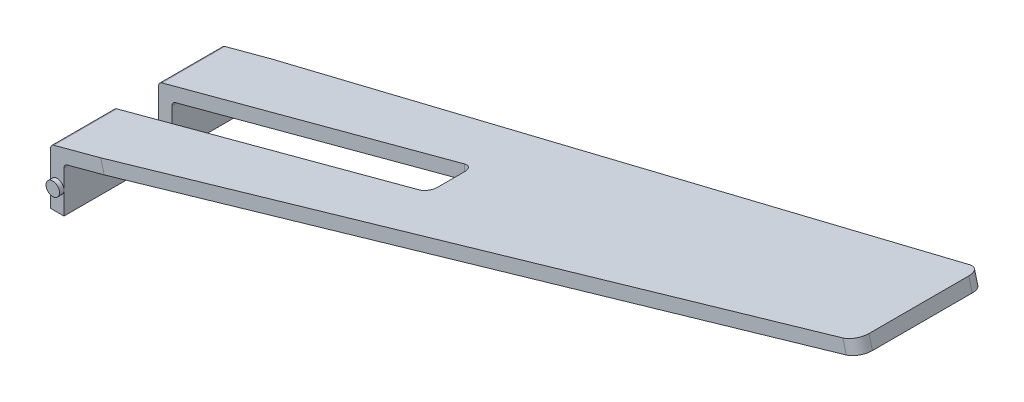
ISO-10303-21;
HEADER;
FILE_DESCRIPTION(('STEP AP214'),'2;1');
FILE_NAME('part.step','',(''),(''),'','','');
FILE_SCHEMA(('AUTOMOTIVE_DESIGN { 1 0 10303 214 1 1 1 1 }'));
ENDSEC;
DATA;
#1=APPLICATION_CONTEXT('core data for automotive mechanical design processes');
#2=APPLICATION_PROTOCOL_DEFINITION('international standard','automotive_design',2000,#1);
#3=PRODUCT_CONTEXT('',#1,'mechanical');
#4=PRODUCT('Part','Part','',(#3));
#5=PRODUCT_RELATED_PRODUCT_CATEGORY('part','',(#4));
#6=PRODUCT_DEFINITION_FORMATION('','',#4);
#7=PRODUCT_DEFINITION_CONTEXT('part definition',#1,'design');
#8=PRODUCT_DEFINITION('design','',#6,#7);
#9=PRODUCT_DEFINITION_SHAPE('','',#8);
#10=(LENGTH_UNIT() NAMED_UNIT(*) SI_UNIT(.MILLI.,.METRE.));
#11=(NAMED_UNIT(*) PLANE_ANGLE_UNIT() SI_UNIT($,.RADIAN.));
#12=(NAMED_UNIT(*) SI_UNIT($,.STERADIAN.) SOLID_ANGLE_UNIT());
#13=UNCERTAINTY_MEASURE_WITH_UNIT(LENGTH_MEASURE(1.E-05),#10,'distance_accuracy_value','');
#14=(GEOMETRIC_REPRESENTATION_CONTEXT(3) GLOBAL_UNCERTAINTY_ASSIGNED_CONTEXT((#13)) GLOBAL_UNIT_ASSIGNED_CONTEXT((#10,
#11,#12)) REPRESENTATION_CONTEXT('',''));
#15=CARTESIAN_POINT('',(0.,0.,0.));
#16=DIRECTION('',(0.,0.,1.));
#17=DIRECTION('',(1.,0.,0.));
#18=AXIS2_PLACEMENT_3D('',#15,#16,#17);
#19=CARTESIAN_POINT('',(0.3,0.,3.8));
#20=DIRECTION('',(0.,1.,0.));
#21=DIRECTION('',(0.,0.,1.));
#22=AXIS2_PLACEMENT_3D('',#19,#20,#21);
#23=PLANE('',#22);
#24=DIRECTION('',(0.,0.,-1.));
#25=VECTOR('',#24,1.);
#26=CARTESIAN_POINT('',(0.,0.,3.8));
#27=LINE('',#26,#25);
#28=CARTESIAN_POINT('',(0.,0.,3.8));
#29=VERTEX_POINT('',#28);
#30=CARTESIAN_POINT('',(0.,0.,2.40000000000001));
#31=VERTEX_POINT('',#30);
#32=EDGE_CURVE('E229',#29,#31,#27,.T.);
#33=ORIENTED_EDGE('',*,*,#32,.T.);
#34=DIRECTION('',(-1.,0.,0.));
#35=VECTOR('',#34,1.);
#36=CARTESIAN_POINT('',(0.,0.,2.40000000000001));
#37=LINE('',#36,#35);
#38=CARTESIAN_POINT('',(0.3,0.,2.40000000000001));
#39=VERTEX_POINT('',#38);
#40=EDGE_CURVE('E222',#39,#31,#37,.T.);
#41=ORIENTED_EDGE('',*,*,#40,.F.);
#42=DIRECTION('',(0.,0.,-1.));
#43=VECTOR('',#42,1.);
#44=CARTESIAN_POINT('',(0.3,0.,3.8));
#45=LINE('',#44,#43);
#46=CARTESIAN_POINT('',(0.3,0.,3.8));
#47=VERTEX_POINT('',#46);
#48=EDGE_CURVE('E249',#47,#39,#45,.T.);
#49=ORIENTED_EDGE('',*,*,#48,.F.);
#50=DIRECTION('',(1.,0.,0.));
#51=VECTOR('',#50,1.);
#52=CARTESIAN_POINT('',(0.3,0.,3.8));
#53=LINE('',#52,#51);
#54=EDGE_CURVE('E419',#29,#47,#53,.T.);
#55=ORIENTED_EDGE('',*,*,#54,.F.);
#56=EDGE_LOOP('',(#33,#41,#49,#55));
#57=FACE_BOUND('',#56,.T.);
#58=ADVANCED_FACE('F39',(#57),#23,.F.);
#59=CARTESIAN_POINT('',(0.3,1.,3.8));
#60=DIRECTION('',(-1.,0.,0.));
#61=DIRECTION('',(0.,-1.,0.));
#62=AXIS2_PLACEMENT_3D('',#59,#60,#61);
#63=PLANE('',#62);
#64=DIRECTION('',(0.,1.,0.));
#65=VECTOR('',#64,1.);
#66=CARTESIAN_POINT('',(0.3,1.,2.40000000000001));
#67=LINE('',#66,#65);
#68=CARTESIAN_POINT('',(0.3,0.923267301202103,2.40000000000001));
#69=VERTEX_POINT('',#68);
#70=EDGE_CURVE('E460',#39,#69,#67,.T.);
#71=ORIENTED_EDGE('',*,*,#70,.T.);
#72=DIRECTION('',(0.,0.,-1.));
#73=VECTOR('',#72,1.);
#74=CARTESIAN_POINT('',(0.3,0.923267301202103,3.8));
#75=LINE('',#74,#73);
#76=CARTESIAN_POINT('',(0.3,0.923267301202103,3.8));
#77=VERTEX_POINT('',#76);
#78=EDGE_CURVE('E321',#69,#77,#75,.F.);
#79=ORIENTED_EDGE('',*,*,#78,.T.);
#80=DIRECTION('',(0.,1.,0.));
#81=VECTOR('',#80,1.);
#82=CARTESIAN_POINT('',(0.3,1.,3.8));
#83=LINE('',#82,#81);
#84=CARTESIAN_POINT('',(0.3,0.5,3.8));
#85=VERTEX_POINT('',#84);
#86=EDGE_CURVE('E423',#85,#77,#83,.T.);
#87=ORIENTED_EDGE('',*,*,#86,.F.);
#88=EDGE_CURVE('E431',#47,#85,#83,.T.);
#89=ORIENTED_EDGE('',*,*,#88,.F.);
#90=ORIENTED_EDGE('',*,*,#48,.T.);
#91=EDGE_LOOP('',(#71,#79,#87,#89,#90));
#92=FACE_BOUND('',#91,.T.);
#93=ADVANCED_FACE('F459',(#92),#63,.F.);
#94=CARTESIAN_POINT('',(0.,0.,3.8));
#95=DIRECTION('',(1.,0.,0.));
#96=DIRECTION('',(0.,0.,-1.));
#97=AXIS2_PLACEMENT_3D('',#94,#95,#96);
#98=PLANE('',#97);
#99=DIRECTION('',(0.,-1.,0.));
#100=VECTOR('',#99,1.);
#101=CARTESIAN_POINT('',(0.,0.,3.8));
#102=LINE('',#101,#100);
#103=CARTESIAN_POINT('',(0.,1.15346539759579,3.8));
#104=VERTEX_POINT('',#103);
#105=CARTESIAN_POINT('',(0.,0.5,3.8));
#106=VERTEX_POINT('',#105);
#107=EDGE_CURVE('E230',#104,#106,#102,.T.);
#108=ORIENTED_EDGE('',*,*,#107,.F.);
#109=DIRECTION('',(0.,0.,-1.));
#110=VECTOR('',#109,1.);
#111=CARTESIAN_POINT('',(0.,1.15346539759579,3.8));
#112=LINE('',#111,#110);
#113=CARTESIAN_POINT('',(0.,1.15346539759579,2.40000000000001));
#114=VERTEX_POINT('',#113);
#115=EDGE_CURVE('E299',#104,#114,#112,.T.);
#116=ORIENTED_EDGE('',*,*,#115,.T.);
#117=DIRECTION('',(0.,-1.,0.));
#118=VECTOR('',#117,1.);
#119=CARTESIAN_POINT('',(0.,0.,2.40000000000001));
#120=LINE('',#119,#118);
#121=EDGE_CURVE('E212',#114,#31,#120,.T.);
#122=ORIENTED_EDGE('',*,*,#121,.T.);
#123=ORIENTED_EDGE('',*,*,#32,.F.);
#124=EDGE_CURVE('E236',#106,#29,#102,.T.);
#125=ORIENTED_EDGE('',*,*,#124,.F.);
#126=EDGE_LOOP('',(#108,#116,#122,#123,#125));
#127=FACE_BOUND('',#126,.T.);
#128=ADVANCED_FACE('F452',(#127),#98,.F.);
#129=CARTESIAN_POINT('',(0.,0.,3.8));
#130=DIRECTION('',(0.,0.,-1.));
#131=DIRECTION('',(-1.,0.,0.));
#132=AXIS2_PLACEMENT_3D('',#129,#130,#131);
#133=PLANE('',#132);
#134=DIRECTION('',(-0.965925826289069,-0.258819045102519,0.));
#135=VECTOR('',#134,1.);
#136=CARTESIAN_POINT('',(0.,1.23019809639369,3.8));
#137=LINE('',#136,#135);
#138=CARTESIAN_POINT('',(1.11394964438383,1.52868000401527,3.8));
#139=VERTEX_POINT('',#138);
#140=CARTESIAN_POINT('',(0.0741180954897481,1.2500579802247,3.8));
#141=VERTEX_POINT('',#140);
#142=EDGE_CURVE('E439',#139,#141,#137,.T.);
#143=ORIENTED_EDGE('',*,*,#142,.T.);
#144=CARTESIAN_POINT('',(0.1,1.15346539759579,3.8));
#145=DIRECTION('',(0.,0.,-1.));
#146=DIRECTION('',(-1.,0.,0.));
#147=AXIS2_PLACEMENT_3D('',#144,#145,#146);
#148=CIRCLE('',#147,0.1);
#149=EDGE_CURVE('E307',#141,#104,#148,.F.);
#150=ORIENTED_EDGE('',*,*,#149,.T.);
#151=ORIENTED_EDGE('',*,*,#107,.T.);
#152=CARTESIAN_POINT('',(0.15,0.5,3.8));
#153=DIRECTION('',(0.,0.,-1.));
#154=DIRECTION('',(-1.,0.,0.));
#155=AXIS2_PLACEMENT_3D('',#152,#153,#154);
#156=CIRCLE('',#155,0.15);
#157=EDGE_CURVE('E401',#106,#85,#156,.T.);
#158=ORIENTED_EDGE('',*,*,#157,.T.);
#159=ORIENTED_EDGE('',*,*,#86,.T.);
#160=CARTESIAN_POINT('',(0.400000000000001,0.923267301202103,3.8));
#161=DIRECTION('',(0.,0.,-1.));
#162=DIRECTION('',(-1.,0.,0.));
#163=AXIS2_PLACEMENT_3D('',#160,#161,#162);
#164=CIRCLE('',#163,0.1);
#165=CARTESIAN_POINT('',(0.374118095489744,1.01985988383101,3.8));
#166=VERTEX_POINT('',#165);
#167=EDGE_CURVE('E334',#77,#166,#164,.T.);
#168=ORIENTED_EDGE('',*,*,#167,.T.);
#169=DIRECTION('',(0.965925826289069,0.258819045102518,0.));
#170=VECTOR('',#169,1.);
#171=CARTESIAN_POINT('',(17.464310586734,5.59916316035229,3.8));
#172=LINE('',#171,#170);
#173=CARTESIAN_POINT('',(1.19159535791459,1.23890225612855,3.8));
#174=VERTEX_POINT('',#173);
#175=EDGE_CURVE('E436',#166,#174,#172,.T.);
#176=ORIENTED_EDGE('',*,*,#175,.T.);
#177=DIRECTION('',(-0.258819045102515,0.96592582628907,0.));
#178=VECTOR('',#177,1.);
#179=CARTESIAN_POINT('',(1.42149916848225,0.380889554236323,3.8));
#180=LINE('',#179,#178);
#181=EDGE_CURVE('E253',#174,#139,#180,.T.);
#182=ORIENTED_EDGE('',*,*,#181,.T.);
#183=EDGE_LOOP('',(#143,#150,#151,#158,#159,#168,#176,#182));
#184=FACE_BOUND('',#183,.T.);
#185=ADVANCED_FACE('F464',(#184),#133,.F.);
#186=CARTESIAN_POINT('',(0.,0.,0.));
#187=DIRECTION('',(0.,0.,-1.));
#188=DIRECTION('',(-1.,0.,0.));
#189=AXIS2_PLACEMENT_3D('',#186,#187,#188);
#190=PLANE('',#189);
#191=DIRECTION('',(0.,-1.,0.));
#192=VECTOR('',#191,1.);
#193=CARTESIAN_POINT('',(0.,0.,0.));
#194=LINE('',#193,#192);
#195=CARTESIAN_POINT('',(0.,1.15346539759579,0.));
#196=VERTEX_POINT('',#195);
#197=CARTESIAN_POINT('',(0.,0.5,0.));
#198=VERTEX_POINT('',#197);
#199=EDGE_CURVE('E240',#196,#198,#194,.T.);
#200=ORIENTED_EDGE('',*,*,#199,.F.);
#201=CARTESIAN_POINT('',(0.1,1.15346539759579,0.));
#202=DIRECTION('',(0.,0.,-1.));
#203=DIRECTION('',(-1.,0.,0.));
#204=AXIS2_PLACEMENT_3D('',#201,#202,#203);
#205=CIRCLE('',#204,0.1);
#206=CARTESIAN_POINT('',(0.0741180954897481,1.2500579802247,0.));
#207=VERTEX_POINT('',#206);
#208=EDGE_CURVE('E288',#196,#207,#205,.T.);
#209=ORIENTED_EDGE('',*,*,#208,.T.);
#210=DIRECTION('',(-0.965925826289069,-0.258819045102519,0.));
#211=VECTOR('',#210,1.);
#212=CARTESIAN_POINT('',(0.,1.23019809639369,0.));
#213=LINE('',#212,#211);
#214=CARTESIAN_POINT('',(1.11394964438383,1.52868000401527,0.));
#215=VERTEX_POINT('',#214);
#216=EDGE_CURVE('E411',#215,#207,#213,.T.);
#217=ORIENTED_EDGE('',*,*,#216,.F.);
#218=DIRECTION('',(0.258819045102515,-0.96592582628907,0.));
#219=VECTOR('',#218,1.);
#220=CARTESIAN_POINT('',(1.19159535791458,1.23890225612859,0.));
#221=LINE('',#220,#219);
#222=CARTESIAN_POINT('',(1.19159535791459,1.23890225612855,0.));
#223=VERTEX_POINT('',#222);
#224=EDGE_CURVE('E271',#215,#223,#221,.T.);
#225=ORIENTED_EDGE('',*,*,#224,.T.);
#226=DIRECTION('',(0.965925826289069,0.258819045102518,0.));
#227=VECTOR('',#226,1.);
#228=CARTESIAN_POINT('',(17.464310586734,5.59916316035229,0.));
#229=LINE('',#228,#227);
#230=CARTESIAN_POINT('',(0.374118095489744,1.01985988383101,0.));
#231=VERTEX_POINT('',#230);
#232=EDGE_CURVE('E397',#231,#223,#229,.T.);
#233=ORIENTED_EDGE('',*,*,#232,.F.);
#234=CARTESIAN_POINT('',(0.400000000000001,0.923267301202103,0.));
#235=DIRECTION('',(0.,0.,-1.));
#236=DIRECTION('',(-1.,0.,0.));
#237=AXIS2_PLACEMENT_3D('',#234,#235,#236);
#238=CIRCLE('',#237,0.1);
#239=CARTESIAN_POINT('',(0.3,0.923267301202103,0.));
#240=VERTEX_POINT('',#239);
#241=EDGE_CURVE('E324',#231,#240,#238,.F.);
#242=ORIENTED_EDGE('',*,*,#241,.T.);
#243=DIRECTION('',(0.,1.,0.));
#244=VECTOR('',#243,1.);
#245=CARTESIAN_POINT('',(0.3,1.,0.));
#246=LINE('',#245,#244);
#247=CARTESIAN_POINT('',(0.3,0.5,0.));
#248=VERTEX_POINT('',#247);
#249=EDGE_CURVE('E398',#248,#240,#246,.T.);
#250=ORIENTED_EDGE('',*,*,#249,.F.);
#251=CARTESIAN_POINT('',(0.15,0.5,0.));
#252=DIRECTION('',(0.,0.,-1.));
#253=DIRECTION('',(-1.,0.,0.));
#254=AXIS2_PLACEMENT_3D('',#251,#252,#253);
#255=CIRCLE('',#254,0.15);
#256=EDGE_CURVE('E213',#198,#248,#255,.T.);
#257=ORIENTED_EDGE('',*,*,#256,.F.);
#258=EDGE_LOOP('',(#200,#209,#217,#225,#233,#242,#250,#257));
#259=FACE_BOUND('',#258,.T.);
#260=ADVANCED_FACE('F524',(#259),#190,.T.);
#261=CARTESIAN_POINT('',(0.3,0.,1.4));
#262=VERTEX_POINT('',#261);
#263=CARTESIAN_POINT('',(0.3,0.,0.));
#264=VERTEX_POINT('',#263);
#265=EDGE_CURVE('E220',#262,#264,#45,.T.);
#266=ORIENTED_EDGE('',*,*,#265,.F.);
#267=DIRECTION('',(1.,0.,0.));
#268=VECTOR('',#267,1.);
#269=CARTESIAN_POINT('',(0.,0.,1.4));
#270=LINE('',#269,#268);
#271=CARTESIAN_POINT('',(0.,0.,1.4));
#272=VERTEX_POINT('',#271);
#273=EDGE_CURVE('E203',#272,#262,#270,.T.);
#274=ORIENTED_EDGE('',*,*,#273,.F.);
#275=CARTESIAN_POINT('',(0.,0.,0.));
#276=VERTEX_POINT('',#275);
#277=EDGE_CURVE('E218',#272,#276,#27,.T.);
#278=ORIENTED_EDGE('',*,*,#277,.T.);
#279=DIRECTION('',(1.,0.,0.));
#280=VECTOR('',#279,1.);
#281=CARTESIAN_POINT('',(0.3,0.,0.));
#282=LINE('',#281,#280);
#283=EDGE_CURVE('E394',#276,#264,#282,.T.);
#284=ORIENTED_EDGE('',*,*,#283,.T.);
#285=EDGE_LOOP('',(#266,#274,#278,#284));
#286=FACE_BOUND('',#285,.T.);
#287=ADVANCED_FACE('F216',(#286),#23,.F.);
#288=ORIENTED_EDGE('',*,*,#249,.T.);
#289=DIRECTION('',(0.,0.,-1.));
#290=VECTOR('',#289,1.);
#291=CARTESIAN_POINT('',(0.3,0.923267301202103,1.4));
#292=LINE('',#291,#290);
#293=CARTESIAN_POINT('',(0.3,0.923267301202103,1.4));
#294=VERTEX_POINT('',#293);
#295=EDGE_CURVE('E318',#240,#294,#292,.F.);
#296=ORIENTED_EDGE('',*,*,#295,.T.);
#297=DIRECTION('',(0.,-1.,0.));
#298=VECTOR('',#297,1.);
#299=CARTESIAN_POINT('',(0.3,1.,1.4));
#300=LINE('',#299,#298);
#301=EDGE_CURVE('E391',#294,#262,#300,.T.);
#302=ORIENTED_EDGE('',*,*,#301,.T.);
#303=ORIENTED_EDGE('',*,*,#265,.T.);
#304=EDGE_CURVE('E390',#264,#248,#246,.T.);
#305=ORIENTED_EDGE('',*,*,#304,.T.);
#306=EDGE_LOOP('',(#288,#296,#302,#303,#305));
#307=FACE_BOUND('',#306,.T.);
#308=ADVANCED_FACE('F389',(#307),#63,.F.);
#309=CARTESIAN_POINT('',(17.464310586734,5.59916316035229,3.8));
#310=DIRECTION('',(-0.258819045102518,0.965925826289069,0.));
#311=DIRECTION('',(-0.965925826289069,-0.258819045102518,0.));
#312=AXIS2_PLACEMENT_3D('',#309,#310,#311);
#313=PLANE('',#312);
#314=DIRECTION('',(0.965500683811203,0.258705128518906,0.0296662440851074));
#315=VECTOR('',#314,1.);
#316=CARTESIAN_POINT('',(17.464310586734,5.59916316035229,0.5));
#317=LINE('',#316,#315);
#318=CARTESIAN_POINT('',(17.1831294562465,5.5238209035113,0.491360349931353));
#319=VERTEX_POINT('',#318);
#320=EDGE_CURVE('E264',#223,#319,#317,.T.);
#321=ORIENTED_EDGE('',*,*,#320,.T.);
#322=CARTESIAN_POINT('',(17.1745328388473,5.52151744682154,0.791228307967168));
#323=DIRECTION('',(-0.258819045102518,0.965925826289069,0.));
#324=DIRECTION('',(-0.965925826289069,-0.258819045102518,0.));
#325=AXIS2_PLACEMENT_3D('',#322,#323,#324);
#326=CIRCLE('',#325,0.3);
#327=CARTESIAN_POINT('',(17.464310586734,5.59916316035229,0.791228307967169));
#328=VERTEX_POINT('',#327);
#329=EDGE_CURVE('E357',#319,#328,#326,.F.);
#330=ORIENTED_EDGE('',*,*,#329,.T.);
#331=DIRECTION('',(0.,0.,-1.));
#332=VECTOR('',#331,1.);
#333=CARTESIAN_POINT('',(17.464310586734,5.59916316035229,3.8));
#334=LINE('',#333,#332);
#335=CARTESIAN_POINT('',(17.464310586734,5.59916316035229,3.00877169203283));
#336=VERTEX_POINT('',#335);
#337=EDGE_CURVE('E245',#336,#328,#334,.T.);
#338=ORIENTED_EDGE('',*,*,#337,.F.);
#339=CARTESIAN_POINT('',(17.1745328388473,5.52151744682154,3.00877169203283));
#340=DIRECTION('',(-0.258819045102518,0.965925826289069,0.));
#341=DIRECTION('',(-0.965925826289069,-0.258819045102518,0.));
#342=AXIS2_PLACEMENT_3D('',#339,#340,#341);
#343=CIRCLE('',#342,0.3);
#344=CARTESIAN_POINT('',(17.1831294562465,5.52382090351131,3.30863965006865));
#345=VERTEX_POINT('',#344);
#346=EDGE_CURVE('E354',#336,#345,#343,.F.);
#347=ORIENTED_EDGE('',*,*,#346,.T.);
#348=DIRECTION('',(0.965500683811203,0.258705128518906,-0.0296662440851074));
#349=VECTOR('',#348,1.);
#350=CARTESIAN_POINT('',(1.19159535791459,1.23890225612855,3.8));
#351=LINE('',#350,#349);
#352=EDGE_CURVE('E268',#345,#174,#351,.F.);
#353=ORIENTED_EDGE('',*,*,#352,.T.);
#354=ORIENTED_EDGE('',*,*,#175,.F.);
#355=DIRECTION('',(0.,0.,-1.));
#356=VECTOR('',#355,1.);
#357=CARTESIAN_POINT('',(0.374118095489749,1.01985988383101,2.40000000000001));
#358=LINE('',#357,#356);
#359=CARTESIAN_POINT('',(0.374118095489741,1.01985988383101,2.40000000000001));
#360=VERTEX_POINT('',#359);
#361=EDGE_CURVE('E310',#166,#360,#358,.T.);
#362=ORIENTED_EDGE('',*,*,#361,.T.);
#363=DIRECTION('',(0.965925826289069,0.258819045102518,0.));
#364=VECTOR('',#363,1.);
#365=CARTESIAN_POINT('',(17.464310586734,5.59916316035229,2.40000000000001));
#366=LINE('',#365,#364);
#367=CARTESIAN_POINT('',(6.8,2.74166975080228,2.40000000000001));
#368=VERTEX_POINT('',#367);
#369=EDGE_CURVE('E473',#360,#368,#366,.T.);
#370=ORIENTED_EDGE('',*,*,#369,.T.);
#371=CARTESIAN_POINT('',(6.8,2.74166975080228,2.20000000000001));
#372=DIRECTION('',(-0.258819045102518,0.965925826289069,0.));
#373=DIRECTION('',(0.965925826289069,0.258819045102518,0.));
#374=AXIS2_PLACEMENT_3D('',#371,#372,#373);
#375=ELLIPSE('',#374,0.207055236082016,0.2);
#376=CARTESIAN_POINT('',(7.,2.7952595892885,2.20000000000001));
#377=VERTEX_POINT('',#376);
#378=EDGE_CURVE('E376',#368,#377,#375,.T.);
#379=ORIENTED_EDGE('',*,*,#378,.T.);
#380=DIRECTION('',(0.,0.,-1.));
#381=VECTOR('',#380,1.);
#382=CARTESIAN_POINT('',(7.,2.7952595892885,3.79999999999999));
#383=LINE('',#382,#381);
#384=CARTESIAN_POINT('',(7.,2.7952595892885,1.60000000000001));
#385=VERTEX_POINT('',#384);
#386=EDGE_CURVE('E483',#377,#385,#383,.T.);
#387=ORIENTED_EDGE('',*,*,#386,.T.);
#388=CARTESIAN_POINT('',(6.8,2.74166975080228,1.60000000000001));
#389=DIRECTION('',(-0.258819045102518,0.965925826289069,0.));
#390=DIRECTION('',(0.965925826289069,0.258819045102518,0.));
#391=AXIS2_PLACEMENT_3D('',#388,#389,#390);
#392=ELLIPSE('',#391,0.207055236082016,0.2);
#393=CARTESIAN_POINT('',(6.8,2.74166975080228,1.40000000000001));
#394=VERTEX_POINT('',#393);
#395=EDGE_CURVE('E48',#385,#394,#392,.T.);
#396=ORIENTED_EDGE('',*,*,#395,.T.);
#397=DIRECTION('',(-0.965925826289069,-0.258819045102518,0.));
#398=VECTOR('',#397,1.);
#399=CARTESIAN_POINT('',(17.464310586734,5.59916316035229,1.40000000000002));
#400=LINE('',#399,#398);
#401=CARTESIAN_POINT('',(0.374118095489737,1.01985988383101,1.4));
#402=VERTEX_POINT('',#401);
#403=EDGE_CURVE('E746',#394,#402,#400,.T.);
#404=ORIENTED_EDGE('',*,*,#403,.T.);
#405=DIRECTION('',(0.,0.,-1.));
#406=VECTOR('',#405,1.);
#407=CARTESIAN_POINT('',(0.374118095489749,1.01985988383101,0.));
#408=LINE('',#407,#406);
#409=EDGE_CURVE('E314',#402,#231,#408,.T.);
#410=ORIENTED_EDGE('',*,*,#409,.T.);
#411=ORIENTED_EDGE('',*,*,#232,.T.);
#412=EDGE_LOOP('',(#321,#330,#338,#347,#353,#354,#362,#370,#379,#387,#396,#404,#410,#411));
#413=FACE_BOUND('',#412,.T.);
#414=ADVANCED_FACE('F472',(#413),#313,.F.);
#415=CARTESIAN_POINT('',(17.3866648732032,5.88894090823902,3.8));
#416=DIRECTION('',(-0.96592582628907,-0.258819045102515,0.));
#417=DIRECTION('',(0.258819045102515,-0.96592582628907,0.));
#418=AXIS2_PLACEMENT_3D('',#415,#416,#417);
#419=PLANE('',#418);
#420=ORIENTED_EDGE('',*,*,#337,.T.);
#421=DIRECTION('',(-0.258819045102515,0.96592582628907,0.));
#422=VECTOR('',#421,1.);
#423=CARTESIAN_POINT('',(17.3866648732032,5.88894090823902,0.791228307967168));
#424=LINE('',#423,#422);
#425=CARTESIAN_POINT('',(17.3866648732032,5.88894090823902,0.791228307967169));
#426=VERTEX_POINT('',#425);
#427=EDGE_CURVE('E341',#328,#426,#424,.T.);
#428=ORIENTED_EDGE('',*,*,#427,.T.);
#429=DIRECTION('',(0.,0.,-1.));
#430=VECTOR('',#429,1.);
#431=CARTESIAN_POINT('',(17.3866648732032,5.88894090823902,3.8));
#432=LINE('',#431,#430);
#433=CARTESIAN_POINT('',(17.3866648732032,5.88894090823902,3.00877169203283));
#434=VERTEX_POINT('',#433);
#435=EDGE_CURVE('E235',#434,#426,#432,.T.);
#436=ORIENTED_EDGE('',*,*,#435,.F.);
#437=DIRECTION('',(-0.258819045102515,0.96592582628907,0.));
#438=VECTOR('',#437,1.);
#439=CARTESIAN_POINT('',(17.464310586734,5.59916316035229,3.00877169203283));
#440=LINE('',#439,#438);
#441=EDGE_CURVE('E337',#434,#336,#440,.F.);
#442=ORIENTED_EDGE('',*,*,#441,.T.);
#443=EDGE_LOOP('',(#420,#428,#436,#442));
#444=FACE_BOUND('',#443,.T.);
#445=ADVANCED_FACE('F549',(#444),#419,.F.);
#446=CARTESIAN_POINT('',(0.,1.23019809639369,3.8));
#447=DIRECTION('',(0.258819045102519,-0.965925826289069,0.));
#448=DIRECTION('',(0.965925826289069,0.258819045102519,0.));
#449=AXIS2_PLACEMENT_3D('',#446,#447,#448);
#450=PLANE('',#449);
#451=ORIENTED_EDGE('',*,*,#435,.T.);
#452=CARTESIAN_POINT('',(17.0968871253165,5.81129519470827,0.791228307967168));
#453=DIRECTION('',(0.258819045102519,-0.965925826289069,0.));
#454=DIRECTION('',(0.965925826289069,0.258819045102519,0.));
#455=AXIS2_PLACEMENT_3D('',#452,#453,#454);
#456=CIRCLE('',#455,0.3);
#457=CARTESIAN_POINT('',(17.1054837427158,5.81359865139803,0.491360349931353));
#458=VERTEX_POINT('',#457);
#459=EDGE_CURVE('E348',#426,#458,#456,.F.);
#460=ORIENTED_EDGE('',*,*,#459,.T.);
#461=DIRECTION('',(-0.965500683811202,-0.258705128518906,-0.0296662440851074));
#462=VECTOR('',#461,1.);
#463=CARTESIAN_POINT('',(17.3866648732032,5.88894090823902,0.5));
#464=LINE('',#463,#462);
#465=EDGE_CURVE('E257',#458,#215,#464,.T.);
#466=ORIENTED_EDGE('',*,*,#465,.T.);
#467=ORIENTED_EDGE('',*,*,#216,.T.);
#468=DIRECTION('',(0.,0.,-1.));
#469=VECTOR('',#468,1.);
#470=CARTESIAN_POINT('',(0.0741180954897481,1.2500579802247,3.8));
#471=LINE('',#470,#469);
#472=CARTESIAN_POINT('',(0.0741180954897481,1.2500579802247,1.4));
#473=VERTEX_POINT('',#472);
#474=EDGE_CURVE('E294',#207,#473,#471,.F.);
#475=ORIENTED_EDGE('',*,*,#474,.T.);
#476=DIRECTION('',(0.965925826289069,0.258819045102519,0.));
#477=VECTOR('',#476,1.);
#478=CARTESIAN_POINT('',(0.,1.23019809639369,1.4));
#479=LINE('',#478,#477);
#480=CARTESIAN_POINT('',(6.8,3.05225260492531,1.40000000000001));
#481=VERTEX_POINT('',#480);
#482=EDGE_CURVE('E725',#473,#481,#479,.T.);
#483=ORIENTED_EDGE('',*,*,#482,.T.);
#484=CARTESIAN_POINT('',(6.8,3.05225260492531,1.60000000000001));
#485=DIRECTION('',(0.258819045102519,-0.965925826289069,0.));
#486=DIRECTION('',(0.965925826289069,0.258819045102519,0.));
#487=AXIS2_PLACEMENT_3D('',#484,#485,#486);
#488=ELLIPSE('',#487,0.207055236082016,0.2);
#489=CARTESIAN_POINT('',(7.,3.10584244341153,1.60000000000001));
#490=VERTEX_POINT('',#489);
#491=EDGE_CURVE('E11',#481,#490,#488,.T.);
#492=ORIENTED_EDGE('',*,*,#491,.T.);
#493=DIRECTION('',(0.,0.,1.));
#494=VECTOR('',#493,1.);
#495=CARTESIAN_POINT('',(7.,3.10584244341153,3.80000000000001));
#496=LINE('',#495,#494);
#497=CARTESIAN_POINT('',(7.,3.10584244341153,2.20000000000001));
#498=VERTEX_POINT('',#497);
#499=EDGE_CURVE('E281',#490,#498,#496,.T.);
#500=ORIENTED_EDGE('',*,*,#499,.T.);
#501=CARTESIAN_POINT('',(6.8,3.05225260492531,2.20000000000001));
#502=DIRECTION('',(0.258819045102519,-0.965925826289069,0.));
#503=DIRECTION('',(0.965925826289069,0.258819045102519,0.));
#504=AXIS2_PLACEMENT_3D('',#501,#502,#503);
#505=ELLIPSE('',#504,0.207055236082016,0.2);
#506=CARTESIAN_POINT('',(6.8,3.05225260492531,2.40000000000001));
#507=VERTEX_POINT('',#506);
#508=EDGE_CURVE('E379',#498,#507,#505,.T.);
#509=ORIENTED_EDGE('',*,*,#508,.T.);
#510=DIRECTION('',(-0.965925826289069,-0.258819045102519,0.));
#511=VECTOR('',#510,1.);
#512=CARTESIAN_POINT('',(0.,1.23019809639369,2.40000000000001));
#513=LINE('',#512,#511);
#514=CARTESIAN_POINT('',(0.0741180954897481,1.2500579802247,2.40000000000001));
#515=VERTEX_POINT('',#514);
#516=EDGE_CURVE('E479',#507,#515,#513,.T.);
#517=ORIENTED_EDGE('',*,*,#516,.T.);
#518=DIRECTION('',(0.,0.,-1.));
#519=VECTOR('',#518,1.);
#520=CARTESIAN_POINT('',(0.0741180954897481,1.2500579802247,3.8));
#521=LINE('',#520,#519);
#522=EDGE_CURVE('E291',#515,#141,#521,.F.);
#523=ORIENTED_EDGE('',*,*,#522,.T.);
#524=ORIENTED_EDGE('',*,*,#142,.F.);
#525=DIRECTION('',(-0.965500683811202,-0.258705128518906,0.0296662440851074));
#526=VECTOR('',#525,1.);
#527=CARTESIAN_POINT('',(1.11394964438383,1.52868000401527,3.8));
#528=LINE('',#527,#526);
#529=CARTESIAN_POINT('',(17.1054837427158,5.81359865139803,3.30863965006865));
#530=VERTEX_POINT('',#529);
#531=EDGE_CURVE('E260',#139,#530,#528,.F.);
#532=ORIENTED_EDGE('',*,*,#531,.T.);
#533=CARTESIAN_POINT('',(17.0968871253165,5.81129519470827,3.00877169203283));
#534=DIRECTION('',(0.258819045102519,-0.965925826289069,0.));
#535=DIRECTION('',(0.965925826289069,0.258819045102519,0.));
#536=AXIS2_PLACEMENT_3D('',#533,#534,#535);
#537=CIRCLE('',#536,0.3);
#538=EDGE_CURVE('E345',#530,#434,#537,.F.);
#539=ORIENTED_EDGE('',*,*,#538,.T.);
#540=EDGE_LOOP('',(#451,#460,#466,#467,#475,#483,#492,#500,#509,#517,#523,#524,#532,#539));
#541=FACE_BOUND('',#540,.T.);
#542=ADVANCED_FACE('F545',(#541),#450,.F.);
#543=DIRECTION('',(0.,1.,0.));
#544=VECTOR('',#543,1.);
#545=CARTESIAN_POINT('',(0.,0.,1.4));
#546=LINE('',#545,#544);
#547=CARTESIAN_POINT('',(0.,1.15346539759579,1.4));
#548=VERTEX_POINT('',#547);
#549=EDGE_CURVE('E199',#272,#548,#546,.T.);
#550=ORIENTED_EDGE('',*,*,#549,.T.);
#551=DIRECTION('',(0.,0.,-1.));
#552=VECTOR('',#551,1.);
#553=CARTESIAN_POINT('',(0.,1.15346539759579,3.8));
#554=LINE('',#553,#552);
#555=EDGE_CURVE('E285',#548,#196,#554,.T.);
#556=ORIENTED_EDGE('',*,*,#555,.T.);
#557=ORIENTED_EDGE('',*,*,#199,.T.);
#558=EDGE_CURVE('E226',#198,#276,#194,.T.);
#559=ORIENTED_EDGE('',*,*,#558,.T.);
#560=ORIENTED_EDGE('',*,*,#277,.F.);
#561=EDGE_LOOP('',(#550,#556,#557,#559,#560));
#562=FACE_BOUND('',#561,.T.);
#563=ADVANCED_FACE('F224',(#562),#98,.F.);
#564=ORIENTED_EDGE('',*,*,#88,.T.);
#565=EDGE_CURVE('E406',#85,#106,#156,.T.);
#566=ORIENTED_EDGE('',*,*,#565,.T.);
#567=ORIENTED_EDGE('',*,*,#124,.T.);
#568=ORIENTED_EDGE('',*,*,#54,.T.);
#569=EDGE_LOOP('',(#564,#566,#567,#568));
#570=FACE_BOUND('',#569,.T.);
#571=ADVANCED_FACE('F449',(#570),#133,.F.);
#572=EDGE_CURVE('E275',#248,#198,#255,.T.);
#573=ORIENTED_EDGE('',*,*,#572,.F.);
#574=ORIENTED_EDGE('',*,*,#304,.F.);
#575=ORIENTED_EDGE('',*,*,#283,.F.);
#576=ORIENTED_EDGE('',*,*,#558,.F.);
#577=EDGE_LOOP('',(#573,#574,#575,#576));
#578=FACE_BOUND('',#577,.T.);
#579=ADVANCED_FACE('F393',(#578),#190,.T.);
#580=CARTESIAN_POINT('',(1.42149916848225,0.380889554236323,3.8));
#581=DIRECTION('',(-0.0286553913308006,-0.00767818896588565,-0.999559860119384));
#582=DIRECTION('',(-0.258819045102515,0.96592582628907,0.));
#583=AXIS2_PLACEMENT_3D('',#580,#581,#582);
#584=PLANE('',#583);
#585=ORIENTED_EDGE('',*,*,#352,.F.);
#586=DIRECTION('',(0.258819045102515,-0.96592582628907,0.));
#587=VECTOR('',#586,1.);
#588=CARTESIAN_POINT('',(17.1054837427158,5.81359865139803,3.30863965006865));
#589=LINE('',#588,#587);
#590=EDGE_CURVE('E360',#345,#530,#589,.F.);
#591=ORIENTED_EDGE('',*,*,#590,.T.);
#592=ORIENTED_EDGE('',*,*,#531,.F.);
#593=ORIENTED_EDGE('',*,*,#181,.F.);
#594=EDGE_LOOP('',(#585,#591,#592,#593));
#595=FACE_BOUND('',#594,.T.);
#596=ADVANCED_FACE('F512',(#595),#584,.F.);
#597=CARTESIAN_POINT('',(17.3866648732032,5.88894090823902,0.5));
#598=DIRECTION('',(0.0286553913308006,0.00767818896588565,-0.999559860119384));
#599=DIRECTION('',(0.258819045102515,-0.96592582628907,0.));
#600=AXIS2_PLACEMENT_3D('',#597,#598,#599);
#601=PLANE('',#600);
#602=ORIENTED_EDGE('',*,*,#465,.F.);
#603=DIRECTION('',(-0.258819045102515,0.96592582628907,0.));
#604=VECTOR('',#603,1.);
#605=CARTESIAN_POINT('',(17.1831294562465,5.52382090351131,0.491360349931353));
#606=LINE('',#605,#604);
#607=EDGE_CURVE('E351',#458,#319,#606,.F.);
#608=ORIENTED_EDGE('',*,*,#607,.T.);
#609=ORIENTED_EDGE('',*,*,#320,.F.);
#610=ORIENTED_EDGE('',*,*,#224,.F.);
#611=EDGE_LOOP('',(#602,#608,#609,#610));
#612=FACE_BOUND('',#611,.T.);
#613=ADVANCED_FACE('F503',(#612),#601,.T.);
#614=CARTESIAN_POINT('',(0.15,0.5,-0.0999999999999998));
#615=DIRECTION('',(0.,0.,1.));
#616=DIRECTION('',(1.,0.,0.));
#617=AXIS2_PLACEMENT_3D('',#614,#615,#616);
#618=PLANE('',#617);
#619=CARTESIAN_POINT('',(0.15,0.5,-0.0999999999999998));
#620=DIRECTION('',(0.,0.,1.));
#621=DIRECTION('',(1.,0.,0.));
#622=AXIS2_PLACEMENT_3D('',#619,#620,#621);
#623=CIRCLE('',#622,0.15);
#624=CARTESIAN_POINT('',(0.3,0.5,-0.0999999999999998));
#625=VERTEX_POINT('',#624);
#626=EDGE_CURVE('E493',#625,#625,#623,.T.);
#627=ORIENTED_EDGE('',*,*,#626,.F.);
#628=EDGE_LOOP('',(#627));
#629=FACE_BOUND('',#628,.T.);
#630=ADVANCED_FACE('F501',(#629),#618,.F.);
#631=CARTESIAN_POINT('',(0.15,0.5,-0.0999999999999998));
#632=DIRECTION('',(0.,0.,1.));
#633=DIRECTION('',(1.,0.,0.));
#634=AXIS2_PLACEMENT_3D('',#631,#632,#633);
#635=CYLINDRICAL_SURFACE('',#634,0.15);
#636=ORIENTED_EDGE('',*,*,#572,.T.);
#637=ORIENTED_EDGE('',*,*,#256,.T.);
#638=EDGE_LOOP('',(#636,#637));
#639=FACE_BOUND('',#638,.T.);
#640=ORIENTED_EDGE('',*,*,#626,.T.);
#641=EDGE_LOOP('',(#640));
#642=FACE_BOUND('',#641,.T.);
#643=ADVANCED_FACE('F499',(#639,#642),#635,.T.);
#644=CARTESIAN_POINT('',(0.15,0.5,3.9));
#645=DIRECTION('',(0.,0.,1.));
#646=DIRECTION('',(1.,0.,0.));
#647=AXIS2_PLACEMENT_3D('',#644,#645,#646);
#648=CIRCLE('',#647,0.15);
#649=CARTESIAN_POINT('',(0.3,0.5,3.9));
#650=VERTEX_POINT('',#649);
#651=EDGE_CURVE('E490',#650,#650,#648,.T.);
#652=ORIENTED_EDGE('',*,*,#651,.F.);
#653=EDGE_LOOP('',(#652));
#654=FACE_BOUND('',#653,.T.);
#655=ORIENTED_EDGE('',*,*,#157,.F.);
#656=ORIENTED_EDGE('',*,*,#565,.F.);
#657=EDGE_LOOP('',(#655,#656));
#658=FACE_BOUND('',#657,.T.);
#659=ADVANCED_FACE('F509',(#654,#658),#635,.T.);
#660=CARTESIAN_POINT('',(0.15,0.5,3.9));
#661=DIRECTION('',(0.,0.,1.));
#662=DIRECTION('',(1.,0.,0.));
#663=AXIS2_PLACEMENT_3D('',#660,#661,#662);
#664=PLANE('',#663);
#665=ORIENTED_EDGE('',*,*,#651,.T.);
#666=EDGE_LOOP('',(#665));
#667=FACE_BOUND('',#666,.T.);
#668=ADVANCED_FACE('F686',(#667),#664,.T.);
#669=CARTESIAN_POINT('',(7.,10.,2.40000000000001));
#670=DIRECTION('',(1.,0.,0.));
#671=DIRECTION('',(0.,0.,-1.));
#672=AXIS2_PLACEMENT_3D('',#669,#670,#671);
#673=PLANE('',#672);
#674=ORIENTED_EDGE('',*,*,#386,.F.);
#675=DIRECTION('',(0.,-1.,0.));
#676=VECTOR('',#675,1.);
#677=CARTESIAN_POINT('',(7.,3.10584244341153,2.20000000000001));
#678=LINE('',#677,#676);
#679=EDGE_CURVE('E371',#377,#498,#678,.F.);
#680=ORIENTED_EDGE('',*,*,#679,.T.);
#681=ORIENTED_EDGE('',*,*,#499,.F.);
#682=DIRECTION('',(0.,-1.,0.));
#683=VECTOR('',#682,1.);
#684=CARTESIAN_POINT('',(7.,2.7952595892885,1.60000000000001));
#685=LINE('',#684,#683);
#686=EDGE_CURVE('E367',#490,#385,#685,.T.);
#687=ORIENTED_EDGE('',*,*,#686,.T.);
#688=EDGE_LOOP('',(#674,#680,#681,#687));
#689=FACE_BOUND('',#688,.T.);
#690=ADVANCED_FACE('F681',(#689),#673,.F.);
#691=CARTESIAN_POINT('',(0.,10.,2.40000000000001));
#692=DIRECTION('',(0.,0.,1.));
#693=DIRECTION('',(1.,0.,0.));
#694=AXIS2_PLACEMENT_3D('',#691,#692,#693);
#695=PLANE('',#694);
#696=ORIENTED_EDGE('',*,*,#516,.F.);
#697=DIRECTION('',(0.,-1.,0.));
#698=VECTOR('',#697,1.);
#699=CARTESIAN_POINT('',(6.8,2.7952595892885,2.40000000000001));
#700=LINE('',#699,#698);
#701=EDGE_CURVE('E363',#507,#368,#700,.T.);
#702=ORIENTED_EDGE('',*,*,#701,.T.);
#703=ORIENTED_EDGE('',*,*,#369,.F.);
#704=CARTESIAN_POINT('',(0.400000000000001,0.923267301202103,2.40000000000001));
#705=DIRECTION('',(0.,0.,1.));
#706=DIRECTION('',(1.,0.,0.));
#707=AXIS2_PLACEMENT_3D('',#704,#705,#706);
#708=CIRCLE('',#707,0.1);
#709=EDGE_CURVE('E331',#360,#69,#708,.T.);
#710=ORIENTED_EDGE('',*,*,#709,.T.);
#711=ORIENTED_EDGE('',*,*,#70,.F.);
#712=ORIENTED_EDGE('',*,*,#40,.T.);
#713=ORIENTED_EDGE('',*,*,#121,.F.);
#714=CARTESIAN_POINT('',(0.1,1.15346539759579,2.40000000000001));
#715=DIRECTION('',(0.,0.,1.));
#716=DIRECTION('',(1.,0.,0.));
#717=AXIS2_PLACEMENT_3D('',#714,#715,#716);
#718=CIRCLE('',#717,0.1);
#719=EDGE_CURVE('E303',#114,#515,#718,.F.);
#720=ORIENTED_EDGE('',*,*,#719,.T.);
#721=EDGE_LOOP('',(#696,#702,#703,#710,#711,#712,#713,#720));
#722=FACE_BOUND('',#721,.T.);
#723=ADVANCED_FACE('F476',(#722),#695,.F.);
#724=CARTESIAN_POINT('',(0.,10.,1.4));
#725=DIRECTION('',(0.,0.,-1.));
#726=DIRECTION('',(-1.,0.,0.));
#727=AXIS2_PLACEMENT_3D('',#724,#725,#726);
#728=PLANE('',#727);
#729=ORIENTED_EDGE('',*,*,#403,.F.);
#730=DIRECTION('',(0.,-1.,0.));
#731=VECTOR('',#730,1.);
#732=CARTESIAN_POINT('',(6.8,3.10584244341153,1.40000000000001));
#733=LINE('',#732,#731);
#734=EDGE_CURVE('E61',#394,#481,#733,.F.);
#735=ORIENTED_EDGE('',*,*,#734,.T.);
#736=ORIENTED_EDGE('',*,*,#482,.F.);
#737=CARTESIAN_POINT('',(0.1,1.15346539759579,1.4));
#738=DIRECTION('',(0.,0.,-1.));
#739=DIRECTION('',(-1.,0.,0.));
#740=AXIS2_PLACEMENT_3D('',#737,#738,#739);
#741=CIRCLE('',#740,0.1);
#742=EDGE_CURVE('E206',#473,#548,#741,.F.);
#743=ORIENTED_EDGE('',*,*,#742,.T.);
#744=ORIENTED_EDGE('',*,*,#549,.F.);
#745=ORIENTED_EDGE('',*,*,#273,.T.);
#746=ORIENTED_EDGE('',*,*,#301,.F.);
#747=CARTESIAN_POINT('',(0.400000000000001,0.923267301202103,1.4));
#748=DIRECTION('',(0.,0.,-1.));
#749=DIRECTION('',(-1.,0.,0.));
#750=AXIS2_PLACEMENT_3D('',#747,#748,#749);
#751=CIRCLE('',#750,0.1);
#752=EDGE_CURVE('E327',#294,#402,#751,.T.);
#753=ORIENTED_EDGE('',*,*,#752,.T.);
#754=EDGE_LOOP('',(#729,#735,#736,#743,#744,#745,#746,#753));
#755=FACE_BOUND('',#754,.T.);
#756=ADVANCED_FACE('F201',(#755),#728,.F.);
#757=CARTESIAN_POINT('',(0.1,1.15346539759579,3.8));
#758=DIRECTION('',(0.,0.,-1.));
#759=DIRECTION('',(-1.,0.,0.));
#760=AXIS2_PLACEMENT_3D('',#757,#758,#759);
#761=CYLINDRICAL_SURFACE('',#760,0.1);
#762=ORIENTED_EDGE('',*,*,#742,.F.);
#763=ORIENTED_EDGE('',*,*,#474,.F.);
#764=ORIENTED_EDGE('',*,*,#208,.F.);
#765=ORIENTED_EDGE('',*,*,#555,.F.);
#766=EDGE_LOOP('',(#762,#763,#764,#765));
#767=FACE_BOUND('',#766,.T.);
#768=ADVANCED_FACE('F586',(#767),#761,.T.);
#769=CARTESIAN_POINT('',(0.1,1.15346539759579,3.8));
#770=DIRECTION('',(0.,0.,-1.));
#771=DIRECTION('',(-1.,0.,0.));
#772=AXIS2_PLACEMENT_3D('',#769,#770,#771);
#773=CYLINDRICAL_SURFACE('',#772,0.1);
#774=ORIENTED_EDGE('',*,*,#149,.F.);
#775=ORIENTED_EDGE('',*,*,#522,.F.);
#776=ORIENTED_EDGE('',*,*,#719,.F.);
#777=ORIENTED_EDGE('',*,*,#115,.F.);
#778=EDGE_LOOP('',(#774,#775,#776,#777));
#779=FACE_BOUND('',#778,.T.);
#780=ADVANCED_FACE('F591',(#779),#773,.T.);
#781=CARTESIAN_POINT('',(0.400000000000001,0.923267301202103,3.8));
#782=DIRECTION('',(0.,0.,1.));
#783=DIRECTION('',(1.,0.,0.));
#784=AXIS2_PLACEMENT_3D('',#781,#782,#783);
#785=CYLINDRICAL_SURFACE('',#784,0.1);
#786=ORIENTED_EDGE('',*,*,#752,.F.);
#787=ORIENTED_EDGE('',*,*,#295,.F.);
#788=ORIENTED_EDGE('',*,*,#241,.F.);
#789=ORIENTED_EDGE('',*,*,#409,.F.);
#790=EDGE_LOOP('',(#786,#787,#788,#789));
#791=FACE_BOUND('',#790,.T.);
#792=ADVANCED_FACE('F603',(#791),#785,.F.);
#793=CARTESIAN_POINT('',(0.400000000000001,0.923267301202103,3.8));
#794=DIRECTION('',(0.,0.,1.));
#795=DIRECTION('',(1.,0.,0.));
#796=AXIS2_PLACEMENT_3D('',#793,#794,#795);
#797=CYLINDRICAL_SURFACE('',#796,0.1);
#798=ORIENTED_EDGE('',*,*,#167,.F.);
#799=ORIENTED_EDGE('',*,*,#78,.F.);
#800=ORIENTED_EDGE('',*,*,#709,.F.);
#801=ORIENTED_EDGE('',*,*,#361,.F.);
#802=EDGE_LOOP('',(#798,#799,#800,#801));
#803=FACE_BOUND('',#802,.T.);
#804=ADVANCED_FACE('F469',(#803),#797,.F.);
#805=CARTESIAN_POINT('',(17.0968871253165,5.81129519470827,0.791228307967168));
#806=DIRECTION('',(0.258819045102515,-0.96592582628907,0.));
#807=DIRECTION('',(0.96592582628907,0.258819045102515,0.));
#808=AXIS2_PLACEMENT_3D('',#805,#806,#807);
#809=CYLINDRICAL_SURFACE('',#808,0.3);
#810=ORIENTED_EDGE('',*,*,#329,.F.);
#811=ORIENTED_EDGE('',*,*,#607,.F.);
#812=ORIENTED_EDGE('',*,*,#459,.F.);
#813=ORIENTED_EDGE('',*,*,#427,.F.);
#814=EDGE_LOOP('',(#810,#811,#812,#813));
#815=FACE_BOUND('',#814,.T.);
#816=ADVANCED_FACE('F622',(#815),#809,.T.);
#817=CARTESIAN_POINT('',(17.0968871253165,5.81129519470827,3.00877169203283));
#818=DIRECTION('',(0.258819045102515,-0.96592582628907,0.));
#819=DIRECTION('',(0.96592582628907,0.258819045102515,0.));
#820=AXIS2_PLACEMENT_3D('',#817,#818,#819);
#821=CYLINDRICAL_SURFACE('',#820,0.3);
#822=ORIENTED_EDGE('',*,*,#538,.F.);
#823=ORIENTED_EDGE('',*,*,#590,.F.);
#824=ORIENTED_EDGE('',*,*,#346,.F.);
#825=ORIENTED_EDGE('',*,*,#441,.F.);
#826=EDGE_LOOP('',(#822,#823,#824,#825));
#827=FACE_BOUND('',#826,.T.);
#828=ADVANCED_FACE('F652',(#827),#821,.T.);
#829=CARTESIAN_POINT('',(6.8,10.,2.20000000000001));
#830=DIRECTION('',(0.,1.,0.));
#831=DIRECTION('',(0.,0.,1.));
#832=AXIS2_PLACEMENT_3D('',#829,#830,#831);
#833=CYLINDRICAL_SURFACE('',#832,0.2);
#834=ORIENTED_EDGE('',*,*,#508,.F.);
#835=ORIENTED_EDGE('',*,*,#679,.F.);
#836=ORIENTED_EDGE('',*,*,#378,.F.);
#837=ORIENTED_EDGE('',*,*,#701,.F.);
#838=EDGE_LOOP('',(#834,#835,#836,#837));
#839=FACE_BOUND('',#838,.T.);
#840=ADVANCED_FACE('F662',(#839),#833,.F.);
#841=CARTESIAN_POINT('',(6.8,10.,1.60000000000001));
#842=DIRECTION('',(0.,1.,0.));
#843=DIRECTION('',(0.,0.,1.));
#844=AXIS2_PLACEMENT_3D('',#841,#842,#843);
#845=CYLINDRICAL_SURFACE('',#844,0.2);
#846=ORIENTED_EDGE('',*,*,#491,.F.);
#847=ORIENTED_EDGE('',*,*,#734,.F.);
#848=ORIENTED_EDGE('',*,*,#395,.F.);
#849=ORIENTED_EDGE('',*,*,#686,.F.);
#850=EDGE_LOOP('',(#846,#847,#848,#849));
#851=FACE_BOUND('',#850,.T.);
#852=ADVANCED_FACE('F41',(#851),#845,.F.);
#853=CLOSED_SHELL('',(#58,#93,#128,#185,#260,#287,#308,#414,#445,#542,#563,#571,#579,#596,#613,
#630,#643,#659,#668,#690,#723,#756,#768,#780,#792,#804,#816,#828,#840,#852));
#854=MANIFOLD_SOLID_BREP('B2',#853);
#855=ADVANCED_BREP_SHAPE_REPRESENTATION('',(#18,#854),#14);
#856=SHAPE_DEFINITION_REPRESENTATION(#9,#855);
ENDSEC;
END-ISO-10303-21;
